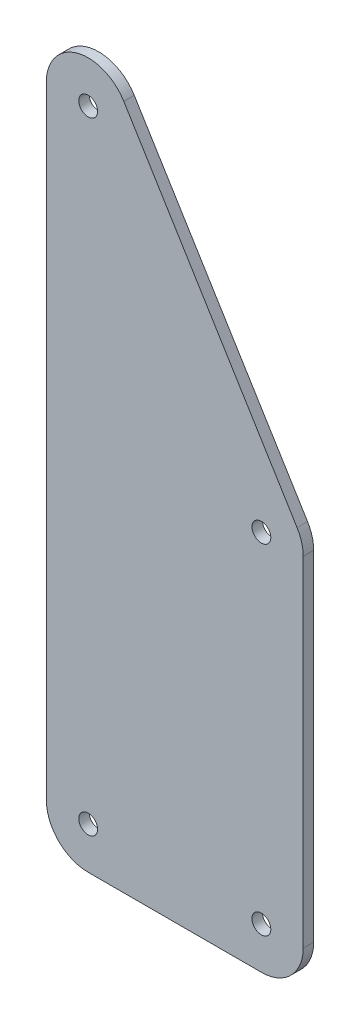
ISO-10303-21;
HEADER;
FILE_DESCRIPTION(('STEP AP214'),'2;1');
FILE_NAME('part.step','',(''),(''),'','','');
FILE_SCHEMA(('AUTOMOTIVE_DESIGN { 1 0 10303 214 1 1 1 1 }'));
ENDSEC;
DATA;
#1=APPLICATION_CONTEXT('core data for automotive mechanical design processes');
#2=APPLICATION_PROTOCOL_DEFINITION('international standard','automotive_design',2000,#1);
#3=PRODUCT_CONTEXT('',#1,'mechanical');
#4=PRODUCT('Part','Part','',(#3));
#5=PRODUCT_RELATED_PRODUCT_CATEGORY('part','',(#4));
#6=PRODUCT_DEFINITION_FORMATION('','',#4);
#7=PRODUCT_DEFINITION_CONTEXT('part definition',#1,'design');
#8=PRODUCT_DEFINITION('design','',#6,#7);
#9=PRODUCT_DEFINITION_SHAPE('','',#8);
#10=(LENGTH_UNIT() NAMED_UNIT(*) SI_UNIT(.MILLI.,.METRE.));
#11=(NAMED_UNIT(*) PLANE_ANGLE_UNIT() SI_UNIT($,.RADIAN.));
#12=(NAMED_UNIT(*) SI_UNIT($,.STERADIAN.) SOLID_ANGLE_UNIT());
#13=UNCERTAINTY_MEASURE_WITH_UNIT(LENGTH_MEASURE(1.E-05),#10,'distance_accuracy_value','');
#14=(GEOMETRIC_REPRESENTATION_CONTEXT(3) GLOBAL_UNCERTAINTY_ASSIGNED_CONTEXT((#13)) GLOBAL_UNIT_ASSIGNED_CONTEXT((#10,
#11,#12)) REPRESENTATION_CONTEXT('',''));
#15=CARTESIAN_POINT('',(0.,0.,0.));
#16=DIRECTION('',(0.,0.,1.));
#17=DIRECTION('',(1.,0.,0.));
#18=AXIS2_PLACEMENT_3D('',#15,#16,#17);
#19=CARTESIAN_POINT('',(32.,507.485708837795,8.));
#20=DIRECTION('',(0.,0.,-1.));
#21=DIRECTION('',(-1.,0.,0.));
#22=AXIS2_PLACEMENT_3D('',#19,#20,#21);
#23=CYLINDRICAL_SURFACE('',#22,32.);
#24=CARTESIAN_POINT('',(32.,507.485708837795,0.));
#25=DIRECTION('',(0.,0.,1.));
#26=DIRECTION('',(-1.,0.,0.));
#27=AXIS2_PLACEMENT_3D('',#24,#25,#26);
#28=CIRCLE('',#27,32.);
#29=CARTESIAN_POINT('',(59.2779224328877,524.216367753252,0.));
#30=VERTEX_POINT('',#29);
#31=CARTESIAN_POINT('',(0.,507.485708837794,0.));
#32=VERTEX_POINT('',#31);
#33=EDGE_CURVE('E139',#30,#32,#28,.T.);
#34=ORIENTED_EDGE('',*,*,#33,.T.);
#35=DIRECTION('',(0.,0.,-1.));
#36=VECTOR('',#35,1.);
#37=CARTESIAN_POINT('',(0.,507.485708837794,8.));
#38=LINE('',#37,#36);
#39=CARTESIAN_POINT('',(0.,507.485708837794,8.));
#40=VERTEX_POINT('',#39);
#41=EDGE_CURVE('E11',#40,#32,#38,.T.);
#42=ORIENTED_EDGE('',*,*,#41,.F.);
#43=CARTESIAN_POINT('',(32.,507.485708837795,8.));
#44=DIRECTION('',(0.,0.,1.));
#45=DIRECTION('',(-1.,0.,0.));
#46=AXIS2_PLACEMENT_3D('',#43,#44,#45);
#47=CIRCLE('',#46,32.);
#48=CARTESIAN_POINT('',(59.2779224328877,524.216367753252,8.));
#49=VERTEX_POINT('',#48);
#50=EDGE_CURVE('E155',#49,#40,#47,.T.);
#51=ORIENTED_EDGE('',*,*,#50,.F.);
#52=DIRECTION('',(0.,0.,-1.));
#53=VECTOR('',#52,1.);
#54=CARTESIAN_POINT('',(59.2779224328877,524.216367753252,8.));
#55=LINE('',#54,#53);
#56=EDGE_CURVE('E134',#49,#30,#55,.T.);
#57=ORIENTED_EDGE('',*,*,#56,.T.);
#58=EDGE_LOOP('',(#34,#42,#51,#57));
#59=FACE_BOUND('',#58,.T.);
#60=ADVANCED_FACE('F41',(#59),#23,.T.);
#61=CARTESIAN_POINT('',(0.,32.0000000000002,8.));
#62=DIRECTION('',(1.,0.,0.));
#63=DIRECTION('',(0.,0.,-1.));
#64=AXIS2_PLACEMENT_3D('',#61,#62,#63);
#65=PLANE('',#64);
#66=DIRECTION('',(0.,-1.,0.));
#67=VECTOR('',#66,1.);
#68=CARTESIAN_POINT('',(0.,32.0000000000002,0.));
#69=LINE('',#68,#67);
#70=CARTESIAN_POINT('',(0.,32.0000000000002,0.));
#71=VERTEX_POINT('',#70);
#72=EDGE_CURVE('E136',#32,#71,#69,.T.);
#73=ORIENTED_EDGE('',*,*,#72,.T.);
#74=DIRECTION('',(0.,0.,-1.));
#75=VECTOR('',#74,1.);
#76=CARTESIAN_POINT('',(0.,32.0000000000002,8.));
#77=LINE('',#76,#75);
#78=CARTESIAN_POINT('',(0.,32.0000000000002,8.));
#79=VERTEX_POINT('',#78);
#80=EDGE_CURVE('E47',#79,#71,#77,.T.);
#81=ORIENTED_EDGE('',*,*,#80,.F.);
#82=DIRECTION('',(0.,-1.,0.));
#83=VECTOR('',#82,1.);
#84=CARTESIAN_POINT('',(0.,32.0000000000002,8.));
#85=LINE('',#84,#83);
#86=EDGE_CURVE('E99',#40,#79,#85,.T.);
#87=ORIENTED_EDGE('',*,*,#86,.F.);
#88=ORIENTED_EDGE('',*,*,#41,.T.);
#89=EDGE_LOOP('',(#73,#81,#87,#88));
#90=FACE_BOUND('',#89,.T.);
#91=ADVANCED_FACE('F239',(#90),#65,.F.);
#92=CARTESIAN_POINT('',(32.,32.,8.));
#93=DIRECTION('',(0.,0.,-1.));
#94=DIRECTION('',(-1.,0.,0.));
#95=AXIS2_PLACEMENT_3D('',#92,#93,#94);
#96=CYLINDRICAL_SURFACE('',#95,32.);
#97=CARTESIAN_POINT('',(32.,32.,0.));
#98=DIRECTION('',(0.,0.,1.));
#99=DIRECTION('',(-1.,0.,0.));
#100=AXIS2_PLACEMENT_3D('',#97,#98,#99);
#101=CIRCLE('',#100,32.);
#102=CARTESIAN_POINT('',(32.0000000000002,0.,0.));
#103=VERTEX_POINT('',#102);
#104=EDGE_CURVE('E141',#71,#103,#101,.T.);
#105=ORIENTED_EDGE('',*,*,#104,.T.);
#106=DIRECTION('',(0.,0.,-1.));
#107=VECTOR('',#106,1.);
#108=CARTESIAN_POINT('',(32.0000000000002,0.,8.));
#109=LINE('',#108,#107);
#110=CARTESIAN_POINT('',(32.0000000000002,0.,8.));
#111=VERTEX_POINT('',#110);
#112=EDGE_CURVE('E157',#111,#103,#109,.T.);
#113=ORIENTED_EDGE('',*,*,#112,.F.);
#114=CARTESIAN_POINT('',(32.,32.,8.));
#115=DIRECTION('',(0.,0.,1.));
#116=DIRECTION('',(-1.,0.,0.));
#117=AXIS2_PLACEMENT_3D('',#114,#115,#116);
#118=CIRCLE('',#117,32.);
#119=EDGE_CURVE('E170',#79,#111,#118,.T.);
#120=ORIENTED_EDGE('',*,*,#119,.F.);
#121=ORIENTED_EDGE('',*,*,#80,.T.);
#122=EDGE_LOOP('',(#105,#113,#120,#121));
#123=FACE_BOUND('',#122,.T.);
#124=ADVANCED_FACE('F164',(#123),#96,.T.);
#125=CARTESIAN_POINT('',(32.0000000000002,0.,8.));
#126=DIRECTION('',(0.,1.,0.));
#127=DIRECTION('',(0.,0.,1.));
#128=AXIS2_PLACEMENT_3D('',#125,#126,#127);
#129=PLANE('',#128);
#130=DIRECTION('',(1.,0.,0.));
#131=VECTOR('',#130,1.);
#132=CARTESIAN_POINT('',(32.0000000000002,0.,0.));
#133=LINE('',#132,#131);
#134=CARTESIAN_POINT('',(164.48,0.,0.));
#135=VERTEX_POINT('',#134);
#136=EDGE_CURVE('E144',#103,#135,#133,.T.);
#137=ORIENTED_EDGE('',*,*,#136,.T.);
#138=DIRECTION('',(0.,0.,-1.));
#139=VECTOR('',#138,1.);
#140=CARTESIAN_POINT('',(164.48,0.,8.));
#141=LINE('',#140,#139);
#142=CARTESIAN_POINT('',(164.48,0.,8.));
#143=VERTEX_POINT('',#142);
#144=EDGE_CURVE('E156',#143,#135,#141,.T.);
#145=ORIENTED_EDGE('',*,*,#144,.F.);
#146=DIRECTION('',(1.,0.,0.));
#147=VECTOR('',#146,1.);
#148=CARTESIAN_POINT('',(32.0000000000002,0.,8.));
#149=LINE('',#148,#147);
#150=EDGE_CURVE('E180',#111,#143,#149,.T.);
#151=ORIENTED_EDGE('',*,*,#150,.F.);
#152=ORIENTED_EDGE('',*,*,#112,.T.);
#153=EDGE_LOOP('',(#137,#145,#151,#152));
#154=FACE_BOUND('',#153,.T.);
#155=ADVANCED_FACE('F175',(#154),#129,.F.);
#156=CARTESIAN_POINT('',(164.48,32.,8.));
#157=DIRECTION('',(0.,0.,-1.));
#158=DIRECTION('',(-1.,0.,0.));
#159=AXIS2_PLACEMENT_3D('',#156,#157,#158);
#160=CYLINDRICAL_SURFACE('',#159,32.);
#161=CARTESIAN_POINT('',(164.48,32.,0.));
#162=DIRECTION('',(0.,0.,1.));
#163=DIRECTION('',(1.,0.,0.));
#164=AXIS2_PLACEMENT_3D('',#161,#162,#163);
#165=CIRCLE('',#164,32.);
#166=CARTESIAN_POINT('',(196.48,32.,0.));
#167=VERTEX_POINT('',#166);
#168=EDGE_CURVE('E150',#135,#167,#165,.T.);
#169=ORIENTED_EDGE('',*,*,#168,.T.);
#170=DIRECTION('',(0.,0.,-1.));
#171=VECTOR('',#170,1.);
#172=CARTESIAN_POINT('',(196.48,32.,8.));
#173=LINE('',#172,#171);
#174=CARTESIAN_POINT('',(196.48,32.,8.));
#175=VERTEX_POINT('',#174);
#176=EDGE_CURVE('E126',#175,#167,#173,.T.);
#177=ORIENTED_EDGE('',*,*,#176,.F.);
#178=CARTESIAN_POINT('',(164.48,32.,8.));
#179=DIRECTION('',(0.,0.,1.));
#180=DIRECTION('',(1.,0.,0.));
#181=AXIS2_PLACEMENT_3D('',#178,#179,#180);
#182=CIRCLE('',#181,32.);
#183=EDGE_CURVE('E118',#143,#175,#182,.T.);
#184=ORIENTED_EDGE('',*,*,#183,.F.);
#185=ORIENTED_EDGE('',*,*,#144,.T.);
#186=EDGE_LOOP('',(#169,#177,#184,#185));
#187=FACE_BOUND('',#186,.T.);
#188=ADVANCED_FACE('F177',(#187),#160,.T.);
#189=CARTESIAN_POINT('',(196.48,32.0000000000002,8.));
#190=DIRECTION('',(-1.,0.,0.));
#191=DIRECTION('',(0.,0.,1.));
#192=AXIS2_PLACEMENT_3D('',#189,#190,#191);
#193=PLANE('',#192);
#194=DIRECTION('',(0.,1.,0.));
#195=VECTOR('',#194,1.);
#196=CARTESIAN_POINT('',(196.48,32.0000000000002,0.));
#197=LINE('',#196,#195);
#198=CARTESIAN_POINT('',(196.48,291.488288642355,0.));
#199=VERTEX_POINT('',#198);
#200=EDGE_CURVE('E130',#167,#199,#197,.T.);
#201=ORIENTED_EDGE('',*,*,#200,.T.);
#202=DIRECTION('',(0.,0.,-1.));
#203=VECTOR('',#202,1.);
#204=CARTESIAN_POINT('',(196.48,291.488288642355,8.));
#205=LINE('',#204,#203);
#206=CARTESIAN_POINT('',(196.48,291.488288642355,8.));
#207=VERTEX_POINT('',#206);
#208=EDGE_CURVE('E125',#207,#199,#205,.T.);
#209=ORIENTED_EDGE('',*,*,#208,.F.);
#210=DIRECTION('',(0.,1.,0.));
#211=VECTOR('',#210,1.);
#212=CARTESIAN_POINT('',(196.48,32.0000000000002,8.));
#213=LINE('',#212,#211);
#214=EDGE_CURVE('E114',#175,#207,#213,.T.);
#215=ORIENTED_EDGE('',*,*,#214,.F.);
#216=ORIENTED_EDGE('',*,*,#176,.T.);
#217=EDGE_LOOP('',(#201,#209,#215,#216));
#218=FACE_BOUND('',#217,.T.);
#219=ADVANCED_FACE('F121',(#218),#193,.F.);
#220=CARTESIAN_POINT('',(164.48,291.488288642356,8.));
#221=DIRECTION('',(0.,0.,-1.));
#222=DIRECTION('',(-1.,0.,0.));
#223=AXIS2_PLACEMENT_3D('',#220,#221,#222);
#224=CYLINDRICAL_SURFACE('',#223,32.);
#225=CARTESIAN_POINT('',(164.48,291.488288642356,0.));
#226=DIRECTION('',(0.,0.,1.));
#227=DIRECTION('',(1.,0.,0.));
#228=AXIS2_PLACEMENT_3D('',#225,#226,#227);
#229=CIRCLE('',#228,32.);
#230=CARTESIAN_POINT('',(191.757922432887,308.218947557814,0.));
#231=VERTEX_POINT('',#230);
#232=EDGE_CURVE('E88',#199,#231,#229,.T.);
#233=ORIENTED_EDGE('',*,*,#232,.T.);
#234=DIRECTION('',(0.,0.,-1.));
#235=VECTOR('',#234,1.);
#236=CARTESIAN_POINT('',(191.757922432887,308.218947557814,8.));
#237=LINE('',#236,#235);
#238=CARTESIAN_POINT('',(191.757922432887,308.218947557814,8.));
#239=VERTEX_POINT('',#238);
#240=EDGE_CURVE('E129',#239,#231,#237,.T.);
#241=ORIENTED_EDGE('',*,*,#240,.F.);
#242=CARTESIAN_POINT('',(164.48,291.488288642356,8.));
#243=DIRECTION('',(0.,0.,1.));
#244=DIRECTION('',(1.,0.,0.));
#245=AXIS2_PLACEMENT_3D('',#242,#243,#244);
#246=CIRCLE('',#245,32.);
#247=EDGE_CURVE('E117',#207,#239,#246,.T.);
#248=ORIENTED_EDGE('',*,*,#247,.F.);
#249=ORIENTED_EDGE('',*,*,#208,.T.);
#250=EDGE_LOOP('',(#233,#241,#248,#249));
#251=FACE_BOUND('',#250,.T.);
#252=ADVANCED_FACE('F131',(#251),#224,.T.);
#253=CARTESIAN_POINT('',(59.2779224328877,524.216367753252,8.));
#254=DIRECTION('',(-0.852435076027714,-0.522833091108075,0.));
#255=DIRECTION('',(0.522833091108075,-0.852435076027714,0.));
#256=AXIS2_PLACEMENT_3D('',#253,#254,#255);
#257=PLANE('',#256);
#258=DIRECTION('',(-0.522833091108075,0.852435076027714,0.));
#259=VECTOR('',#258,1.);
#260=CARTESIAN_POINT('',(59.2779224328877,524.216367753252,0.));
#261=LINE('',#260,#259);
#262=EDGE_CURVE('E95',#231,#30,#261,.T.);
#263=ORIENTED_EDGE('',*,*,#262,.T.);
#264=ORIENTED_EDGE('',*,*,#56,.F.);
#265=DIRECTION('',(-0.522833091108075,0.852435076027714,0.));
#266=VECTOR('',#265,1.);
#267=CARTESIAN_POINT('',(59.2779224328877,524.216367753252,8.));
#268=LINE('',#267,#266);
#269=EDGE_CURVE('E60',#239,#49,#268,.T.);
#270=ORIENTED_EDGE('',*,*,#269,.F.);
#271=ORIENTED_EDGE('',*,*,#240,.T.);
#272=EDGE_LOOP('',(#263,#264,#270,#271));
#273=FACE_BOUND('',#272,.T.);
#274=ADVANCED_FACE('F228',(#273),#257,.F.);
#275=CARTESIAN_POINT('',(32.,507.485708837795,8.));
#276=DIRECTION('',(0.,0.,-1.));
#277=DIRECTION('',(-1.,0.,0.));
#278=AXIS2_PLACEMENT_3D('',#275,#276,#277);
#279=PLANE('',#278);
#280=CARTESIAN_POINT('',(32.,507.485708837795,8.));
#281=DIRECTION('',(0.,0.,-1.));
#282=DIRECTION('',(-1.,0.,0.));
#283=AXIS2_PLACEMENT_3D('',#280,#281,#282);
#284=CIRCLE('',#283,7.19999999999996);
#285=CARTESIAN_POINT('',(24.8,507.485708837795,8.));
#286=VERTEX_POINT('',#285);
#287=EDGE_CURVE('E143',#286,#286,#284,.T.);
#288=ORIENTED_EDGE('',*,*,#287,.T.);
#289=EDGE_LOOP('',(#288));
#290=FACE_BOUND('',#289,.T.);
#291=CARTESIAN_POINT('',(164.48,32.,8.));
#292=DIRECTION('',(0.,0.,-1.));
#293=DIRECTION('',(-1.,0.,0.));
#294=AXIS2_PLACEMENT_3D('',#291,#292,#293);
#295=CIRCLE('',#294,7.19999999999998);
#296=CARTESIAN_POINT('',(157.28,32.,8.));
#297=VERTEX_POINT('',#296);
#298=EDGE_CURVE('E187',#297,#297,#295,.T.);
#299=ORIENTED_EDGE('',*,*,#298,.T.);
#300=EDGE_LOOP('',(#299));
#301=FACE_BOUND('',#300,.T.);
#302=CARTESIAN_POINT('',(32.,32.,8.));
#303=DIRECTION('',(0.,0.,-1.));
#304=DIRECTION('',(-1.,0.,0.));
#305=AXIS2_PLACEMENT_3D('',#302,#303,#304);
#306=CIRCLE('',#305,7.2);
#307=CARTESIAN_POINT('',(24.8,32.,8.));
#308=VERTEX_POINT('',#307);
#309=EDGE_CURVE('E190',#308,#308,#306,.T.);
#310=ORIENTED_EDGE('',*,*,#309,.T.);
#311=EDGE_LOOP('',(#310));
#312=FACE_BOUND('',#311,.T.);
#313=CARTESIAN_POINT('',(164.48,291.488288642356,8.));
#314=DIRECTION('',(0.,0.,-1.));
#315=DIRECTION('',(-1.,0.,0.));
#316=AXIS2_PLACEMENT_3D('',#313,#314,#315);
#317=CIRCLE('',#316,7.20000000000002);
#318=CARTESIAN_POINT('',(157.28,291.488288642356,8.));
#319=VERTEX_POINT('',#318);
#320=EDGE_CURVE('E192',#319,#319,#317,.T.);
#321=ORIENTED_EDGE('',*,*,#320,.T.);
#322=EDGE_LOOP('',(#321));
#323=FACE_BOUND('',#322,.T.);
#324=ORIENTED_EDGE('',*,*,#50,.T.);
#325=ORIENTED_EDGE('',*,*,#86,.T.);
#326=ORIENTED_EDGE('',*,*,#119,.T.);
#327=ORIENTED_EDGE('',*,*,#150,.T.);
#328=ORIENTED_EDGE('',*,*,#183,.T.);
#329=ORIENTED_EDGE('',*,*,#214,.T.);
#330=ORIENTED_EDGE('',*,*,#247,.T.);
#331=ORIENTED_EDGE('',*,*,#269,.T.);
#332=EDGE_LOOP('',(#324,#325,#326,#327,#328,#329,#330,#331));
#333=FACE_BOUND('',#332,.T.);
#334=ADVANCED_FACE('F113',(#290,#301,#312,#323,#333),#279,.F.);
#335=CARTESIAN_POINT('',(32.,507.485708837795,0.));
#336=DIRECTION('',(0.,0.,-1.));
#337=DIRECTION('',(-1.,0.,0.));
#338=AXIS2_PLACEMENT_3D('',#335,#336,#337);
#339=PLANE('',#338);
#340=CARTESIAN_POINT('',(32.,507.485708837795,0.));
#341=DIRECTION('',(0.,0.,-1.));
#342=DIRECTION('',(-1.,0.,0.));
#343=AXIS2_PLACEMENT_3D('',#340,#341,#342);
#344=CIRCLE('',#343,7.19999999999996);
#345=CARTESIAN_POINT('',(24.8,507.485708837795,0.));
#346=VERTEX_POINT('',#345);
#347=EDGE_CURVE('E198',#346,#346,#344,.T.);
#348=ORIENTED_EDGE('',*,*,#347,.F.);
#349=EDGE_LOOP('',(#348));
#350=FACE_BOUND('',#349,.T.);
#351=CARTESIAN_POINT('',(164.48,32.,0.));
#352=DIRECTION('',(0.,0.,-1.));
#353=DIRECTION('',(-1.,0.,0.));
#354=AXIS2_PLACEMENT_3D('',#351,#352,#353);
#355=CIRCLE('',#354,7.19999999999998);
#356=CARTESIAN_POINT('',(157.28,32.,0.));
#357=VERTEX_POINT('',#356);
#358=EDGE_CURVE('E203',#357,#357,#355,.T.);
#359=ORIENTED_EDGE('',*,*,#358,.F.);
#360=EDGE_LOOP('',(#359));
#361=FACE_BOUND('',#360,.T.);
#362=CARTESIAN_POINT('',(32.,32.,0.));
#363=DIRECTION('',(0.,0.,-1.));
#364=DIRECTION('',(-1.,0.,0.));
#365=AXIS2_PLACEMENT_3D('',#362,#363,#364);
#366=CIRCLE('',#365,7.2);
#367=CARTESIAN_POINT('',(24.8,32.,0.));
#368=VERTEX_POINT('',#367);
#369=EDGE_CURVE('E197',#368,#368,#366,.T.);
#370=ORIENTED_EDGE('',*,*,#369,.F.);
#371=EDGE_LOOP('',(#370));
#372=FACE_BOUND('',#371,.T.);
#373=CARTESIAN_POINT('',(164.48,291.488288642356,0.));
#374=DIRECTION('',(0.,0.,-1.));
#375=DIRECTION('',(-1.,0.,0.));
#376=AXIS2_PLACEMENT_3D('',#373,#374,#375);
#377=CIRCLE('',#376,7.20000000000002);
#378=CARTESIAN_POINT('',(157.28,291.488288642356,0.));
#379=VERTEX_POINT('',#378);
#380=EDGE_CURVE('E199',#379,#379,#377,.T.);
#381=ORIENTED_EDGE('',*,*,#380,.F.);
#382=EDGE_LOOP('',(#381));
#383=FACE_BOUND('',#382,.T.);
#384=ORIENTED_EDGE('',*,*,#33,.F.);
#385=ORIENTED_EDGE('',*,*,#262,.F.);
#386=ORIENTED_EDGE('',*,*,#232,.F.);
#387=ORIENTED_EDGE('',*,*,#200,.F.);
#388=ORIENTED_EDGE('',*,*,#168,.F.);
#389=ORIENTED_EDGE('',*,*,#136,.F.);
#390=ORIENTED_EDGE('',*,*,#104,.F.);
#391=ORIENTED_EDGE('',*,*,#72,.F.);
#392=EDGE_LOOP('',(#384,#385,#386,#387,#388,#389,#390,#391));
#393=FACE_BOUND('',#392,.T.);
#394=ADVANCED_FACE('F171',(#350,#361,#372,#383,#393),#339,.T.);
#395=CARTESIAN_POINT('',(164.48,291.488288642356,16.));
#396=DIRECTION('',(0.,0.,-1.));
#397=DIRECTION('',(-1.,0.,0.));
#398=AXIS2_PLACEMENT_3D('',#395,#396,#397);
#399=CYLINDRICAL_SURFACE('',#398,7.20000000000002);
#400=ORIENTED_EDGE('',*,*,#380,.T.);
#401=EDGE_LOOP('',(#400));
#402=FACE_BOUND('',#401,.T.);
#403=ORIENTED_EDGE('',*,*,#320,.F.);
#404=EDGE_LOOP('',(#403));
#405=FACE_BOUND('',#404,.T.);
#406=ADVANCED_FACE('F212',(#402,#405),#399,.F.);
#407=CARTESIAN_POINT('',(32.,32.,16.));
#408=DIRECTION('',(0.,0.,-1.));
#409=DIRECTION('',(-1.,0.,0.));
#410=AXIS2_PLACEMENT_3D('',#407,#408,#409);
#411=CYLINDRICAL_SURFACE('',#410,7.2);
#412=ORIENTED_EDGE('',*,*,#369,.T.);
#413=EDGE_LOOP('',(#412));
#414=FACE_BOUND('',#413,.T.);
#415=ORIENTED_EDGE('',*,*,#309,.F.);
#416=EDGE_LOOP('',(#415));
#417=FACE_BOUND('',#416,.T.);
#418=ADVANCED_FACE('F221',(#414,#417),#411,.F.);
#419=CARTESIAN_POINT('',(164.48,32.,16.));
#420=DIRECTION('',(0.,0.,-1.));
#421=DIRECTION('',(-1.,0.,0.));
#422=AXIS2_PLACEMENT_3D('',#419,#420,#421);
#423=CYLINDRICAL_SURFACE('',#422,7.19999999999998);
#424=ORIENTED_EDGE('',*,*,#358,.T.);
#425=EDGE_LOOP('',(#424));
#426=FACE_BOUND('',#425,.T.);
#427=ORIENTED_EDGE('',*,*,#298,.F.);
#428=EDGE_LOOP('',(#427));
#429=FACE_BOUND('',#428,.T.);
#430=ADVANCED_FACE('F291',(#426,#429),#423,.F.);
#431=CARTESIAN_POINT('',(32.,507.485708837795,16.));
#432=DIRECTION('',(0.,0.,-1.));
#433=DIRECTION('',(-1.,0.,0.));
#434=AXIS2_PLACEMENT_3D('',#431,#432,#433);
#435=CYLINDRICAL_SURFACE('',#434,7.19999999999996);
#436=ORIENTED_EDGE('',*,*,#347,.T.);
#437=EDGE_LOOP('',(#436));
#438=FACE_BOUND('',#437,.T.);
#439=ORIENTED_EDGE('',*,*,#287,.F.);
#440=EDGE_LOOP('',(#439));
#441=FACE_BOUND('',#440,.T.);
#442=ADVANCED_FACE('F207',(#438,#441),#435,.F.);
#443=CLOSED_SHELL('',(#60,#91,#124,#155,#188,#219,#252,#274,#334,#394,#406,#418,#430,#442));
#444=MANIFOLD_SOLID_BREP('B2',#443);
#445=ADVANCED_BREP_SHAPE_REPRESENTATION('',(#18,#444),#14);
#446=SHAPE_DEFINITION_REPRESENTATION(#9,#445);
ENDSEC;
END-ISO-10303-21;
